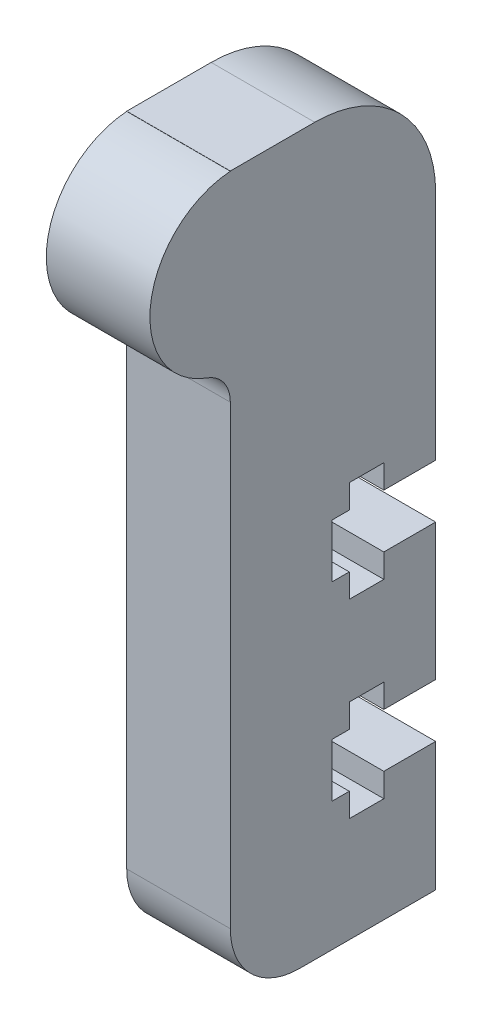
ISO-10303-21;
HEADER;
FILE_DESCRIPTION(('STEP AP214'),'2;1');
FILE_NAME('part.step','',(''),(''),'','','');
FILE_SCHEMA(('AUTOMOTIVE_DESIGN { 1 0 10303 214 1 1 1 1 }'));
ENDSEC;
DATA;
#1=APPLICATION_CONTEXT('core data for automotive mechanical design processes');
#2=APPLICATION_PROTOCOL_DEFINITION('international standard','automotive_design',2000,#1);
#3=PRODUCT_CONTEXT('',#1,'mechanical');
#4=PRODUCT('Part','Part','',(#3));
#5=PRODUCT_RELATED_PRODUCT_CATEGORY('part','',(#4));
#6=PRODUCT_DEFINITION_FORMATION('','',#4);
#7=PRODUCT_DEFINITION_CONTEXT('part definition',#1,'design');
#8=PRODUCT_DEFINITION('design','',#6,#7);
#9=PRODUCT_DEFINITION_SHAPE('','',#8);
#10=(LENGTH_UNIT() NAMED_UNIT(*) SI_UNIT(.MILLI.,.METRE.));
#11=(NAMED_UNIT(*) PLANE_ANGLE_UNIT() SI_UNIT($,.RADIAN.));
#12=(NAMED_UNIT(*) SI_UNIT($,.STERADIAN.) SOLID_ANGLE_UNIT());
#13=UNCERTAINTY_MEASURE_WITH_UNIT(LENGTH_MEASURE(1.E-05),#10,'distance_accuracy_value','');
#14=(GEOMETRIC_REPRESENTATION_CONTEXT(3) GLOBAL_UNCERTAINTY_ASSIGNED_CONTEXT((#13)) GLOBAL_UNIT_ASSIGNED_CONTEXT((#10,
#11,#12)) REPRESENTATION_CONTEXT('',''));
#15=CARTESIAN_POINT('',(0.,0.,0.));
#16=DIRECTION('',(0.,0.,1.));
#17=DIRECTION('',(1.,0.,0.));
#18=AXIS2_PLACEMENT_3D('',#15,#16,#17);
#19=CARTESIAN_POINT('',(-145.250000000058,55.695492388253,2.59251729978901E-13));
#20=DIRECTION('',(0.,0.,1.));
#21=DIRECTION('',(1.,0.,0.));
#22=AXIS2_PLACEMENT_3D('',#19,#20,#21);
#23=PLANE('',#22);
#24=DIRECTION('',(0.,1.,0.));
#25=VECTOR('',#24,1.);
#26=CARTESIAN_POINT('',(-151.250000000058,55.6954923882527,2.62473765699227E-13));
#27=LINE('',#26,#25);
#28=CARTESIAN_POINT('',(-151.250000000058,55.6954923882527,2.62473765699227E-13));
#29=VERTEX_POINT('',#28);
#30=CARTESIAN_POINT('',(-151.250000000059,63.1454923882525,1.72303843189274E-13));
#31=VERTEX_POINT('',#30);
#32=EDGE_CURVE('E425',#29,#31,#27,.T.);
#33=ORIENTED_EDGE('',*,*,#32,.T.);
#34=DIRECTION('',(-1.,0.,0.));
#35=VECTOR('',#34,1.);
#36=CARTESIAN_POINT('',(-131.250000000059,63.1454923882538,1.61563724121521E-13));
#37=LINE('',#36,#35);
#38=CARTESIAN_POINT('',(-145.250000000059,63.1454923882529,1.69081807468948E-13));
#39=VERTEX_POINT('',#38);
#40=EDGE_CURVE('E308',#39,#31,#37,.T.);
#41=ORIENTED_EDGE('',*,*,#40,.F.);
#42=DIRECTION('',(0.,1.,0.));
#43=VECTOR('',#42,1.);
#44=CARTESIAN_POINT('',(-145.250000000058,55.695492388253,2.59251729978901E-13));
#45=LINE('',#44,#43);
#46=CARTESIAN_POINT('',(-145.250000000058,55.695492388253,2.59251729978901E-13));
#47=VERTEX_POINT('',#46);
#48=EDGE_CURVE('E440',#47,#39,#45,.T.);
#49=ORIENTED_EDGE('',*,*,#48,.F.);
#50=DIRECTION('',(-1.,0.,0.));
#51=VECTOR('',#50,1.);
#52=CARTESIAN_POINT('',(-145.250000000058,55.695492388253,2.59251729978901E-13));
#53=LINE('',#52,#51);
#54=EDGE_CURVE('E467',#47,#29,#53,.T.);
#55=ORIENTED_EDGE('',*,*,#54,.T.);
#56=EDGE_LOOP('',(#33,#41,#49,#55));
#57=FACE_BOUND('',#56,.T.);
#58=ADVANCED_FACE('F34',(#57),#23,.F.);
#59=CARTESIAN_POINT('',(-145.250000000059,66.2454923882529,1.67347083992971E-13));
#60=VERTEX_POINT('',#59);
#61=CARTESIAN_POINT('',(-145.250000000059,74.1454923882529,0.));
#62=VERTEX_POINT('',#61);
#63=EDGE_CURVE('E444',#60,#62,#45,.T.);
#64=ORIENTED_EDGE('',*,*,#63,.F.);
#65=DIRECTION('',(-1.,0.,0.));
#66=VECTOR('',#65,1.);
#67=CARTESIAN_POINT('',(-131.250000000059,66.2454923882538,1.59829000645544E-13));
#68=LINE('',#67,#66);
#69=CARTESIAN_POINT('',(-151.250000000059,66.2454923882525,1.70569119713297E-13));
#70=VERTEX_POINT('',#69);
#71=EDGE_CURVE('E310',#60,#70,#68,.T.);
#72=ORIENTED_EDGE('',*,*,#71,.T.);
#73=CARTESIAN_POINT('',(-151.25000000006,74.1454923882525,0.));
#74=VERTEX_POINT('',#73);
#75=EDGE_CURVE('E464',#70,#74,#27,.T.);
#76=ORIENTED_EDGE('',*,*,#75,.T.);
#77=DIRECTION('',(-1.,0.,0.));
#78=VECTOR('',#77,1.);
#79=CARTESIAN_POINT('',(-131.25000000006,74.1454923882538,0.));
#80=LINE('',#79,#78);
#81=EDGE_CURVE('E381',#62,#74,#80,.T.);
#82=ORIENTED_EDGE('',*,*,#81,.F.);
#83=EDGE_LOOP('',(#64,#72,#76,#82));
#84=FACE_BOUND('',#83,.T.);
#85=ADVANCED_FACE('F522',(#84),#23,.F.);
#86=CARTESIAN_POINT('',(-145.25000000006,90.695492388253,7.00000000000027));
#87=DIRECTION('',(-1.,0.,0.));
#88=DIRECTION('',(0.,-1.,0.));
#89=AXIS2_PLACEMENT_3D('',#86,#87,#88);
#90=CYLINDRICAL_SURFACE('',#89,7.00000000000001);
#91=CARTESIAN_POINT('',(-151.25000000006,90.6954923882527,7.00000000000027));
#92=DIRECTION('',(1.,0.,0.));
#93=DIRECTION('',(0.,1.,0.));
#94=AXIS2_PLACEMENT_3D('',#91,#92,#93);
#95=CIRCLE('',#94,7.00000000000001);
#96=CARTESIAN_POINT('',(-151.25000000006,90.6954923882526,2.64208489175204E-13));
#97=VERTEX_POINT('',#96);
#98=CARTESIAN_POINT('',(-151.250000000061,97.6954923882527,7.00000000000032));
#99=VERTEX_POINT('',#98);
#100=EDGE_CURVE('E420',#97,#99,#95,.T.);
#101=ORIENTED_EDGE('',*,*,#100,.T.);
#102=DIRECTION('',(-1.,0.,0.));
#103=VECTOR('',#102,1.);
#104=CARTESIAN_POINT('',(-145.250000000061,97.695492388253,7.00000000000032));
#105=LINE('',#104,#103);
#106=CARTESIAN_POINT('',(-145.250000000061,97.695492388253,7.00000000000032));
#107=VERTEX_POINT('',#106);
#108=EDGE_CURVE('E11',#107,#99,#105,.T.);
#109=ORIENTED_EDGE('',*,*,#108,.F.);
#110=CARTESIAN_POINT('',(-145.25000000006,90.695492388253,7.00000000000027));
#111=DIRECTION('',(1.,0.,0.));
#112=DIRECTION('',(0.,1.,0.));
#113=AXIS2_PLACEMENT_3D('',#110,#111,#112);
#114=CIRCLE('',#113,7.00000000000001);
#115=CARTESIAN_POINT('',(-145.25000000006,90.695492388253,2.60986453454878E-13));
#116=VERTEX_POINT('',#115);
#117=EDGE_CURVE('E421',#116,#107,#114,.T.);
#118=ORIENTED_EDGE('',*,*,#117,.F.);
#119=DIRECTION('',(-1.,0.,0.));
#120=VECTOR('',#119,1.);
#121=CARTESIAN_POINT('',(-145.25000000006,90.695492388253,2.60986453454878E-13));
#122=LINE('',#121,#120);
#123=EDGE_CURVE('E443',#116,#97,#122,.T.);
#124=ORIENTED_EDGE('',*,*,#123,.T.);
#125=EDGE_LOOP('',(#101,#109,#118,#124));
#126=FACE_BOUND('',#125,.T.);
#127=ADVANCED_FACE('F36',(#126),#90,.T.);
#128=CARTESIAN_POINT('',(-145.250000000061,97.695492388253,7.00000000000032));
#129=DIRECTION('',(0.,-1.,0.));
#130=DIRECTION('',(1.,0.,0.));
#131=AXIS2_PLACEMENT_3D('',#128,#129,#130);
#132=PLANE('',#131);
#133=DIRECTION('',(0.,0.,1.));
#134=VECTOR('',#133,1.);
#135=CARTESIAN_POINT('',(-151.250000000061,97.6954923882527,7.00000000000032));
#136=LINE('',#135,#134);
#137=CARTESIAN_POINT('',(-151.250000000061,97.6954923882527,11.8901193530446));
#138=VERTEX_POINT('',#137);
#139=EDGE_CURVE('E447',#99,#138,#136,.T.);
#140=ORIENTED_EDGE('',*,*,#139,.T.);
#141=DIRECTION('',(-1.,0.,0.));
#142=VECTOR('',#141,1.);
#143=CARTESIAN_POINT('',(-145.250000000061,97.695492388253,11.8901193530446));
#144=LINE('',#143,#142);
#145=CARTESIAN_POINT('',(-145.250000000061,97.695492388253,11.8901193530446));
#146=VERTEX_POINT('',#145);
#147=EDGE_CURVE('E42',#146,#138,#144,.T.);
#148=ORIENTED_EDGE('',*,*,#147,.F.);
#149=DIRECTION('',(0.,0.,1.));
#150=VECTOR('',#149,1.);
#151=CARTESIAN_POINT('',(-145.250000000061,97.695492388253,7.00000000000032));
#152=LINE('',#151,#150);
#153=EDGE_CURVE('E424',#107,#146,#152,.T.);
#154=ORIENTED_EDGE('',*,*,#153,.F.);
#155=ORIENTED_EDGE('',*,*,#108,.T.);
#156=EDGE_LOOP('',(#140,#148,#154,#155));
#157=FACE_BOUND('',#156,.T.);
#158=ADVANCED_FACE('F511',(#157),#132,.F.);
#159=CARTESIAN_POINT('',(-145.250000000061,97.695492388253,11.8901193530446));
#160=DIRECTION('',(0.,0.0686506090468687,-0.997640763941357));
#161=DIRECTION('',(0.,0.997640763941357,0.0686506090468687));
#162=AXIS2_PLACEMENT_3D('',#159,#160,#161);
#163=PLANE('',#162);
#164=DIRECTION('',(0.,-0.997640763941357,-0.0686506090468687));
#165=VECTOR('',#164,1.);
#166=CARTESIAN_POINT('',(-151.250000000061,97.6954923882527,11.8901193530446));
#167=LINE('',#166,#165);
#168=CARTESIAN_POINT('',(-151.250000000061,97.6836962079594,11.8893076230203));
#169=VERTEX_POINT('',#168);
#170=EDGE_CURVE('E449',#138,#169,#167,.T.);
#171=ORIENTED_EDGE('',*,*,#170,.T.);
#172=DIRECTION('',(-1.,0.,0.));
#173=VECTOR('',#172,1.);
#174=CARTESIAN_POINT('',(-145.250000000061,97.6836962079598,11.8893076230203));
#175=LINE('',#174,#173);
#176=CARTESIAN_POINT('',(-145.250000000061,97.6836962079598,11.8893076230203));
#177=VERTEX_POINT('',#176);
#178=EDGE_CURVE('E482',#177,#169,#175,.T.);
#179=ORIENTED_EDGE('',*,*,#178,.F.);
#180=DIRECTION('',(0.,-0.997640763941357,-0.0686506090468687));
#181=VECTOR('',#180,1.);
#182=CARTESIAN_POINT('',(-145.250000000061,97.695492388253,11.8901193530446));
#183=LINE('',#182,#181);
#184=EDGE_CURVE('E427',#146,#177,#183,.T.);
#185=ORIENTED_EDGE('',*,*,#184,.F.);
#186=ORIENTED_EDGE('',*,*,#147,.T.);
#187=EDGE_LOOP('',(#171,#179,#185,#186));
#188=FACE_BOUND('',#187,.T.);
#189=ADVANCED_FACE('F489',(#188),#163,.F.);
#190=CARTESIAN_POINT('',(-145.25000000006,92.695492388253,11.5460545777855));
#191=DIRECTION('',(-1.,0.,0.));
#192=DIRECTION('',(0.,-1.,0.));
#193=AXIS2_PLACEMENT_3D('',#190,#191,#192);
#194=CYLINDRICAL_SURFACE('',#193,5.);
#195=CARTESIAN_POINT('',(-151.25000000006,92.6954923882527,11.5460545777855));
#196=DIRECTION('',(1.,0.,0.));
#197=DIRECTION('',(0.,1.,0.));
#198=AXIS2_PLACEMENT_3D('',#195,#196,#197);
#199=CIRCLE('',#198,5.);
#200=CARTESIAN_POINT('',(-151.25000000006,87.983958279693,13.2198067529532));
#201=VERTEX_POINT('',#200);
#202=EDGE_CURVE('E451',#169,#201,#199,.T.);
#203=ORIENTED_EDGE('',*,*,#202,.T.);
#204=DIRECTION('',(-1.,0.,0.));
#205=VECTOR('',#204,1.);
#206=CARTESIAN_POINT('',(-145.25000000006,87.9839582796933,13.2198067529532));
#207=LINE('',#206,#205);
#208=CARTESIAN_POINT('',(-145.25000000006,87.9839582796933,13.2198067529532));
#209=VERTEX_POINT('',#208);
#210=EDGE_CURVE('E479',#209,#201,#207,.T.);
#211=ORIENTED_EDGE('',*,*,#210,.F.);
#212=CARTESIAN_POINT('',(-145.25000000006,92.695492388253,11.5460545777855));
#213=DIRECTION('',(1.,0.,0.));
#214=DIRECTION('',(0.,1.,0.));
#215=AXIS2_PLACEMENT_3D('',#212,#213,#214);
#216=CIRCLE('',#215,5.);
#217=EDGE_CURVE('E429',#177,#209,#216,.T.);
#218=ORIENTED_EDGE('',*,*,#217,.F.);
#219=ORIENTED_EDGE('',*,*,#178,.T.);
#220=EDGE_LOOP('',(#203,#211,#218,#219));
#221=FACE_BOUND('',#220,.T.);
#222=ADVANCED_FACE('F498',(#221),#194,.T.);
#223=CARTESIAN_POINT('',(-145.25000000006,86.0993446362695,13.8893076230203));
#224=DIRECTION('',(-1.,0.,0.));
#225=DIRECTION('',(0.,-1.,0.));
#226=AXIS2_PLACEMENT_3D('',#223,#224,#225);
#227=CYLINDRICAL_SURFACE('',#226,2.);
#228=CARTESIAN_POINT('',(-151.25000000006,86.0993446362691,13.8893076230203));
#229=DIRECTION('',(-1.,0.,0.));
#230=DIRECTION('',(0.,1.,0.));
#231=AXIS2_PLACEMENT_3D('',#228,#229,#230);
#232=CIRCLE('',#231,2.);
#233=CARTESIAN_POINT('',(-151.25000000006,86.0993446362691,11.8893076230203));
#234=VERTEX_POINT('',#233);
#235=EDGE_CURVE('E453',#201,#234,#232,.T.);
#236=ORIENTED_EDGE('',*,*,#235,.T.);
#237=DIRECTION('',(-1.,0.,0.));
#238=VECTOR('',#237,1.);
#239=CARTESIAN_POINT('',(-145.25000000006,86.0993446362695,11.8893076230203));
#240=LINE('',#239,#238);
#241=CARTESIAN_POINT('',(-145.25000000006,86.0993446362695,11.8893076230203));
#242=VERTEX_POINT('',#241);
#243=EDGE_CURVE('E476',#242,#234,#240,.T.);
#244=ORIENTED_EDGE('',*,*,#243,.F.);
#245=CARTESIAN_POINT('',(-145.25000000006,86.0993446362695,13.8893076230203));
#246=DIRECTION('',(-1.,0.,0.));
#247=DIRECTION('',(0.,1.,0.));
#248=AXIS2_PLACEMENT_3D('',#245,#246,#247);
#249=CIRCLE('',#248,2.);
#250=EDGE_CURVE('E431',#209,#242,#249,.T.);
#251=ORIENTED_EDGE('',*,*,#250,.F.);
#252=ORIENTED_EDGE('',*,*,#210,.T.);
#253=EDGE_LOOP('',(#236,#244,#251,#252));
#254=FACE_BOUND('',#253,.T.);
#255=ADVANCED_FACE('F502',(#254),#227,.F.);
#256=CARTESIAN_POINT('',(-145.250000000058,59.695492388253,11.8893076230203));
#257=DIRECTION('',(0.,0.,-1.));
#258=DIRECTION('',(-1.,0.,0.));
#259=AXIS2_PLACEMENT_3D('',#256,#257,#258);
#260=PLANE('',#259);
#261=DIRECTION('',(0.,-1.,0.));
#262=VECTOR('',#261,1.);
#263=CARTESIAN_POINT('',(-151.250000000058,59.6954923882527,11.8893076230203));
#264=LINE('',#263,#262);
#265=CARTESIAN_POINT('',(-151.250000000058,59.6954923882527,11.8893076230203));
#266=VERTEX_POINT('',#265);
#267=EDGE_CURVE('E455',#234,#266,#264,.T.);
#268=ORIENTED_EDGE('',*,*,#267,.T.);
#269=DIRECTION('',(-1.,0.,0.));
#270=VECTOR('',#269,1.);
#271=CARTESIAN_POINT('',(-145.250000000058,59.695492388253,11.8893076230203));
#272=LINE('',#271,#270);
#273=CARTESIAN_POINT('',(-145.250000000058,59.695492388253,11.8893076230203));
#274=VERTEX_POINT('',#273);
#275=EDGE_CURVE('E473',#274,#266,#272,.T.);
#276=ORIENTED_EDGE('',*,*,#275,.F.);
#277=DIRECTION('',(0.,-1.,0.));
#278=VECTOR('',#277,1.);
#279=CARTESIAN_POINT('',(-145.250000000058,59.695492388253,11.8893076230203));
#280=LINE('',#279,#278);
#281=EDGE_CURVE('E433',#242,#274,#280,.T.);
#282=ORIENTED_EDGE('',*,*,#281,.F.);
#283=ORIENTED_EDGE('',*,*,#243,.T.);
#284=EDGE_LOOP('',(#268,#276,#282,#283));
#285=FACE_BOUND('',#284,.T.);
#286=ADVANCED_FACE('F573',(#285),#260,.F.);
#287=CARTESIAN_POINT('',(-145.250000000058,59.695492388253,7.88930762302026));
#288=DIRECTION('',(-1.,0.,0.));
#289=DIRECTION('',(0.,-1.,0.));
#290=AXIS2_PLACEMENT_3D('',#287,#288,#289);
#291=CYLINDRICAL_SURFACE('',#290,3.99999999999999);
#292=CARTESIAN_POINT('',(-151.250000000058,59.6954923882527,7.88930762302027));
#293=DIRECTION('',(1.,0.,0.));
#294=DIRECTION('',(0.,-1.,0.));
#295=AXIS2_PLACEMENT_3D('',#292,#293,#294);
#296=CIRCLE('',#295,3.99999999999999);
#297=CARTESIAN_POINT('',(-151.250000000058,55.6954923882527,7.88930762302027));
#298=VERTEX_POINT('',#297);
#299=EDGE_CURVE('E457',#266,#298,#296,.T.);
#300=ORIENTED_EDGE('',*,*,#299,.T.);
#301=DIRECTION('',(-1.,0.,0.));
#302=VECTOR('',#301,1.);
#303=CARTESIAN_POINT('',(-145.250000000058,55.695492388253,7.88930762302026));
#304=LINE('',#303,#302);
#305=CARTESIAN_POINT('',(-145.250000000058,55.695492388253,7.88930762302026));
#306=VERTEX_POINT('',#305);
#307=EDGE_CURVE('E470',#306,#298,#304,.T.);
#308=ORIENTED_EDGE('',*,*,#307,.F.);
#309=CARTESIAN_POINT('',(-145.250000000058,59.695492388253,7.88930762302026));
#310=DIRECTION('',(1.,0.,0.));
#311=DIRECTION('',(0.,-1.,0.));
#312=AXIS2_PLACEMENT_3D('',#309,#310,#311);
#313=CIRCLE('',#312,3.99999999999999);
#314=EDGE_CURVE('E435',#274,#306,#313,.T.);
#315=ORIENTED_EDGE('',*,*,#314,.F.);
#316=ORIENTED_EDGE('',*,*,#275,.T.);
#317=EDGE_LOOP('',(#300,#308,#315,#316));
#318=FACE_BOUND('',#317,.T.);
#319=ADVANCED_FACE('F551',(#318),#291,.T.);
#320=CARTESIAN_POINT('',(-145.250000000058,55.695492388253,7.88930762302026));
#321=DIRECTION('',(0.,1.,0.));
#322=DIRECTION('',(-1.,0.,0.));
#323=AXIS2_PLACEMENT_3D('',#320,#321,#322);
#324=PLANE('',#323);
#325=DIRECTION('',(0.,0.,-1.));
#326=VECTOR('',#325,1.);
#327=CARTESIAN_POINT('',(-151.250000000058,55.6954923882527,7.88930762302027));
#328=LINE('',#327,#326);
#329=EDGE_CURVE('E459',#298,#29,#328,.T.);
#330=ORIENTED_EDGE('',*,*,#329,.T.);
#331=ORIENTED_EDGE('',*,*,#54,.F.);
#332=DIRECTION('',(0.,0.,-1.));
#333=VECTOR('',#332,1.);
#334=CARTESIAN_POINT('',(-145.250000000058,55.695492388253,7.88930762302026));
#335=LINE('',#334,#333);
#336=EDGE_CURVE('E437',#306,#47,#335,.T.);
#337=ORIENTED_EDGE('',*,*,#336,.F.);
#338=ORIENTED_EDGE('',*,*,#307,.T.);
#339=EDGE_LOOP('',(#330,#331,#337,#338));
#340=FACE_BOUND('',#339,.T.);
#341=ADVANCED_FACE('F544',(#340),#324,.F.);
#342=CARTESIAN_POINT('',(-145.250000000059,77.2454923882529,0.));
#343=VERTEX_POINT('',#342);
#344=EDGE_CURVE('E439',#343,#116,#45,.T.);
#345=ORIENTED_EDGE('',*,*,#344,.F.);
#346=DIRECTION('',(-1.,0.,0.));
#347=VECTOR('',#346,1.);
#348=CARTESIAN_POINT('',(-131.25000000006,77.2454923882538,0.));
#349=LINE('',#348,#347);
#350=CARTESIAN_POINT('',(-151.25000000006,77.2454923882525,0.));
#351=VERTEX_POINT('',#350);
#352=EDGE_CURVE('E384',#343,#351,#349,.T.);
#353=ORIENTED_EDGE('',*,*,#352,.T.);
#354=EDGE_CURVE('E461',#351,#97,#27,.T.);
#355=ORIENTED_EDGE('',*,*,#354,.T.);
#356=ORIENTED_EDGE('',*,*,#123,.F.);
#357=EDGE_LOOP('',(#345,#353,#355,#356));
#358=FACE_BOUND('',#357,.T.);
#359=ADVANCED_FACE('F542',(#358),#23,.F.);
#360=CARTESIAN_POINT('',(-145.25000000006,90.695492388253,7.00000000000027));
#361=DIRECTION('',(1.,0.,0.));
#362=DIRECTION('',(0.,1.,0.));
#363=AXIS2_PLACEMENT_3D('',#360,#361,#362);
#364=PLANE('',#363);
#365=DIRECTION('',(0.,0.,-1.));
#366=VECTOR('',#365,1.);
#367=CARTESIAN_POINT('',(-145.250000000059,63.1454923882529,7.00000000000027));
#368=LINE('',#367,#366);
#369=CARTESIAN_POINT('',(-145.250000000059,63.1454923882529,3.00000000000017));
#370=VERTEX_POINT('',#369);
#371=EDGE_CURVE('E331',#370,#39,#368,.T.);
#372=ORIENTED_EDGE('',*,*,#371,.F.);
#373=DIRECTION('',(0.,1.,0.));
#374=VECTOR('',#373,1.);
#375=CARTESIAN_POINT('',(-145.25000000006,90.695492388253,3.00000000000017));
#376=LINE('',#375,#374);
#377=CARTESIAN_POINT('',(-145.250000000059,61.7704923882529,3.00000000000017));
#378=VERTEX_POINT('',#377);
#379=EDGE_CURVE('E333',#378,#370,#376,.T.);
#380=ORIENTED_EDGE('',*,*,#379,.F.);
#381=DIRECTION('',(0.,0.,-1.));
#382=VECTOR('',#381,1.);
#383=CARTESIAN_POINT('',(-145.250000000058,61.7704923882529,7.00000000000027));
#384=LINE('',#383,#382);
#385=CARTESIAN_POINT('',(-145.250000000058,61.7704923882529,5.00000000000017));
#386=VERTEX_POINT('',#385);
#387=EDGE_CURVE('E335',#386,#378,#384,.T.);
#388=ORIENTED_EDGE('',*,*,#387,.F.);
#389=DIRECTION('',(0.,-1.,0.));
#390=VECTOR('',#389,1.);
#391=CARTESIAN_POINT('',(-145.25000000006,90.695492388253,5.00000000000019));
#392=LINE('',#391,#390);
#393=CARTESIAN_POINT('',(-145.250000000059,63.1454923882529,5.00000000000017));
#394=VERTEX_POINT('',#393);
#395=EDGE_CURVE('E337',#394,#386,#392,.T.);
#396=ORIENTED_EDGE('',*,*,#395,.F.);
#397=DIRECTION('',(0.,0.,-1.));
#398=VECTOR('',#397,1.);
#399=CARTESIAN_POINT('',(-145.250000000059,63.1454923882529,7.00000000000027));
#400=LINE('',#399,#398);
#401=CARTESIAN_POINT('',(-145.250000000059,63.1454923882529,6.00000000000017));
#402=VERTEX_POINT('',#401);
#403=EDGE_CURVE('E339',#402,#394,#400,.T.);
#404=ORIENTED_EDGE('',*,*,#403,.F.);
#405=DIRECTION('',(0.,-1.,0.));
#406=VECTOR('',#405,1.);
#407=CARTESIAN_POINT('',(-145.25000000006,90.695492388253,6.00000000000015));
#408=LINE('',#407,#406);
#409=CARTESIAN_POINT('',(-145.250000000059,66.2454923882529,6.00000000000017));
#410=VERTEX_POINT('',#409);
#411=EDGE_CURVE('E301',#410,#402,#408,.T.);
#412=ORIENTED_EDGE('',*,*,#411,.F.);
#413=DIRECTION('',(0.,0.,1.));
#414=VECTOR('',#413,1.);
#415=CARTESIAN_POINT('',(-145.250000000059,66.2454923882529,7.00000000000027));
#416=LINE('',#415,#414);
#417=CARTESIAN_POINT('',(-145.250000000059,66.2454923882529,5.00000000000017));
#418=VERTEX_POINT('',#417);
#419=EDGE_CURVE('E259',#418,#410,#416,.T.);
#420=ORIENTED_EDGE('',*,*,#419,.F.);
#421=DIRECTION('',(0.,-1.,0.));
#422=VECTOR('',#421,1.);
#423=CARTESIAN_POINT('',(-145.25000000006,90.695492388253,5.00000000000014));
#424=LINE('',#423,#422);
#425=CARTESIAN_POINT('',(-145.250000000059,67.6204923882529,5.00000000000017));
#426=VERTEX_POINT('',#425);
#427=EDGE_CURVE('E323',#426,#418,#424,.T.);
#428=ORIENTED_EDGE('',*,*,#427,.F.);
#429=DIRECTION('',(0.,0.,1.));
#430=VECTOR('',#429,1.);
#431=CARTESIAN_POINT('',(-145.250000000059,67.6204923882529,7.00000000000027));
#432=LINE('',#431,#430);
#433=CARTESIAN_POINT('',(-145.250000000059,67.6204923882529,3.00000000000017));
#434=VERTEX_POINT('',#433);
#435=EDGE_CURVE('E325',#434,#426,#432,.T.);
#436=ORIENTED_EDGE('',*,*,#435,.F.);
#437=DIRECTION('',(0.,1.,0.));
#438=VECTOR('',#437,1.);
#439=CARTESIAN_POINT('',(-145.25000000006,90.695492388253,3.00000000000016));
#440=LINE('',#439,#438);
#441=CARTESIAN_POINT('',(-145.250000000059,66.2454923882529,3.00000000000017));
#442=VERTEX_POINT('',#441);
#443=EDGE_CURVE('E327',#442,#434,#440,.T.);
#444=ORIENTED_EDGE('',*,*,#443,.F.);
#445=DIRECTION('',(0.,0.,1.));
#446=VECTOR('',#445,1.);
#447=CARTESIAN_POINT('',(-145.250000000059,66.2454923882529,7.00000000000027));
#448=LINE('',#447,#446);
#449=EDGE_CURVE('E329',#60,#442,#448,.T.);
#450=ORIENTED_EDGE('',*,*,#449,.F.);
#451=ORIENTED_EDGE('',*,*,#63,.T.);
#452=DIRECTION('',(0.,0.,-1.));
#453=VECTOR('',#452,1.);
#454=CARTESIAN_POINT('',(-145.250000000059,74.1454923882529,7.00000000000027));
#455=LINE('',#454,#453);
#456=CARTESIAN_POINT('',(-145.250000000059,74.1454923882529,3.00000000000004));
#457=VERTEX_POINT('',#456);
#458=EDGE_CURVE('E409',#457,#62,#455,.T.);
#459=ORIENTED_EDGE('',*,*,#458,.F.);
#460=DIRECTION('',(0.,1.,0.));
#461=VECTOR('',#460,1.);
#462=CARTESIAN_POINT('',(-145.25000000006,90.695492388253,3.00000000000004));
#463=LINE('',#462,#461);
#464=CARTESIAN_POINT('',(-145.250000000059,72.7704923882529,3.00000000000004));
#465=VERTEX_POINT('',#464);
#466=EDGE_CURVE('E412',#465,#457,#463,.T.);
#467=ORIENTED_EDGE('',*,*,#466,.F.);
#468=DIRECTION('',(0.,0.,-1.));
#469=VECTOR('',#468,1.);
#470=CARTESIAN_POINT('',(-145.250000000059,72.7704923882529,7.00000000000027));
#471=LINE('',#470,#469);
#472=CARTESIAN_POINT('',(-145.250000000059,72.7704923882529,5.00000000000004));
#473=VERTEX_POINT('',#472);
#474=EDGE_CURVE('E414',#473,#465,#471,.T.);
#475=ORIENTED_EDGE('',*,*,#474,.F.);
#476=DIRECTION('',(0.,-1.,0.));
#477=VECTOR('',#476,1.);
#478=CARTESIAN_POINT('',(-145.25000000006,90.695492388253,5.00000000000005));
#479=LINE('',#478,#477);
#480=CARTESIAN_POINT('',(-145.250000000059,74.1454923882529,5.00000000000004));
#481=VERTEX_POINT('',#480);
#482=EDGE_CURVE('E416',#481,#473,#479,.T.);
#483=ORIENTED_EDGE('',*,*,#482,.F.);
#484=DIRECTION('',(0.,0.,-1.));
#485=VECTOR('',#484,1.);
#486=CARTESIAN_POINT('',(-145.250000000059,74.1454923882529,7.00000000000027));
#487=LINE('',#486,#485);
#488=CARTESIAN_POINT('',(-145.250000000059,74.1454923882529,6.00000000000004));
#489=VERTEX_POINT('',#488);
#490=EDGE_CURVE('E418',#489,#481,#487,.T.);
#491=ORIENTED_EDGE('',*,*,#490,.F.);
#492=DIRECTION('',(0.,-1.,0.));
#493=VECTOR('',#492,1.);
#494=CARTESIAN_POINT('',(-145.25000000006,90.695492388253,6.00000000000003));
#495=LINE('',#494,#493);
#496=CARTESIAN_POINT('',(-145.250000000059,77.2454923882529,6.00000000000003));
#497=VERTEX_POINT('',#496);
#498=EDGE_CURVE('E374',#497,#489,#495,.T.);
#499=ORIENTED_EDGE('',*,*,#498,.F.);
#500=DIRECTION('',(0.,0.,1.));
#501=VECTOR('',#500,1.);
#502=CARTESIAN_POINT('',(-145.250000000059,77.2454923882529,7.00000000000027));
#503=LINE('',#502,#501);
#504=CARTESIAN_POINT('',(-145.250000000059,77.2454923882529,5.00000000000004));
#505=VERTEX_POINT('',#504);
#506=EDGE_CURVE('E399',#505,#497,#503,.T.);
#507=ORIENTED_EDGE('',*,*,#506,.F.);
#508=DIRECTION('',(0.,-1.,0.));
#509=VECTOR('',#508,1.);
#510=CARTESIAN_POINT('',(-145.25000000006,90.695492388253,5.00000000000002));
#511=LINE('',#510,#509);
#512=CARTESIAN_POINT('',(-145.250000000059,78.6204923882529,5.00000000000003));
#513=VERTEX_POINT('',#512);
#514=EDGE_CURVE('E401',#513,#505,#511,.T.);
#515=ORIENTED_EDGE('',*,*,#514,.F.);
#516=DIRECTION('',(0.,0.,1.));
#517=VECTOR('',#516,1.);
#518=CARTESIAN_POINT('',(-145.25000000006,78.6204923882529,7.00000000000027));
#519=LINE('',#518,#517);
#520=CARTESIAN_POINT('',(-145.25000000006,78.6204923882529,3.00000000000003));
#521=VERTEX_POINT('',#520);
#522=EDGE_CURVE('E403',#521,#513,#519,.T.);
#523=ORIENTED_EDGE('',*,*,#522,.F.);
#524=DIRECTION('',(0.,1.,0.));
#525=VECTOR('',#524,1.);
#526=CARTESIAN_POINT('',(-145.25000000006,90.695492388253,3.00000000000003));
#527=LINE('',#526,#525);
#528=CARTESIAN_POINT('',(-145.250000000059,77.2454923882529,3.00000000000003));
#529=VERTEX_POINT('',#528);
#530=EDGE_CURVE('E405',#529,#521,#527,.T.);
#531=ORIENTED_EDGE('',*,*,#530,.F.);
#532=DIRECTION('',(0.,0.,1.));
#533=VECTOR('',#532,1.);
#534=CARTESIAN_POINT('',(-145.250000000059,77.2454923882529,7.00000000000027));
#535=LINE('',#534,#533);
#536=EDGE_CURVE('E407',#343,#529,#535,.T.);
#537=ORIENTED_EDGE('',*,*,#536,.F.);
#538=ORIENTED_EDGE('',*,*,#344,.T.);
#539=ORIENTED_EDGE('',*,*,#117,.T.);
#540=ORIENTED_EDGE('',*,*,#153,.T.);
#541=ORIENTED_EDGE('',*,*,#184,.T.);
#542=ORIENTED_EDGE('',*,*,#217,.T.);
#543=ORIENTED_EDGE('',*,*,#250,.T.);
#544=ORIENTED_EDGE('',*,*,#281,.T.);
#545=ORIENTED_EDGE('',*,*,#314,.T.);
#546=ORIENTED_EDGE('',*,*,#336,.T.);
#547=ORIENTED_EDGE('',*,*,#48,.T.);
#548=EDGE_LOOP('',(#372,#380,#388,#396,#404,#412,#420,#428,#436,#444,#450,#451,#459,#467,#475,
#483,#491,#499,#507,#515,#523,#531,#537,#538,#539,#540,#541,#542,#543,#544,#545,#546,#547));
#549=FACE_BOUND('',#548,.T.);
#550=ADVANCED_FACE('F507',(#549),#364,.T.);
#551=CARTESIAN_POINT('',(-151.25000000006,90.6954923882527,7.00000000000027));
#552=DIRECTION('',(1.,0.,0.));
#553=DIRECTION('',(0.,1.,0.));
#554=AXIS2_PLACEMENT_3D('',#551,#552,#553);
#555=PLANE('',#554);
#556=DIRECTION('',(0.,-1.,0.));
#557=VECTOR('',#556,1.);
#558=CARTESIAN_POINT('',(-151.250000000059,61.7704923882525,3.00000000000017));
#559=LINE('',#558,#557);
#560=CARTESIAN_POINT('',(-151.250000000059,63.1454923882525,3.00000000000017));
#561=VERTEX_POINT('',#560);
#562=CARTESIAN_POINT('',(-151.250000000059,61.7704923882525,3.00000000000017));
#563=VERTEX_POINT('',#562);
#564=EDGE_CURVE('E290',#561,#563,#559,.T.);
#565=ORIENTED_EDGE('',*,*,#564,.F.);
#566=DIRECTION('',(0.,0.,1.));
#567=VECTOR('',#566,1.);
#568=CARTESIAN_POINT('',(-151.250000000059,63.1454923882525,3.00000000000017));
#569=LINE('',#568,#567);
#570=EDGE_CURVE('E287',#31,#561,#569,.T.);
#571=ORIENTED_EDGE('',*,*,#570,.F.);
#572=ORIENTED_EDGE('',*,*,#32,.F.);
#573=ORIENTED_EDGE('',*,*,#329,.F.);
#574=ORIENTED_EDGE('',*,*,#299,.F.);
#575=ORIENTED_EDGE('',*,*,#267,.F.);
#576=ORIENTED_EDGE('',*,*,#235,.F.);
#577=ORIENTED_EDGE('',*,*,#202,.F.);
#578=ORIENTED_EDGE('',*,*,#170,.F.);
#579=ORIENTED_EDGE('',*,*,#139,.F.);
#580=ORIENTED_EDGE('',*,*,#100,.F.);
#581=ORIENTED_EDGE('',*,*,#354,.F.);
#582=DIRECTION('',(0.,0.,-1.));
#583=VECTOR('',#582,1.);
#584=CARTESIAN_POINT('',(-151.25000000006,77.2454923882525,3.00000000000004));
#585=LINE('',#584,#583);
#586=CARTESIAN_POINT('',(-151.25000000006,77.2454923882525,3.00000000000004));
#587=VERTEX_POINT('',#586);
#588=EDGE_CURVE('E357',#587,#351,#585,.T.);
#589=ORIENTED_EDGE('',*,*,#588,.F.);
#590=DIRECTION('',(0.,-1.,0.));
#591=VECTOR('',#590,1.);
#592=CARTESIAN_POINT('',(-151.25000000006,77.2454923882525,3.00000000000004));
#593=LINE('',#592,#591);
#594=CARTESIAN_POINT('',(-151.25000000006,78.6204923882525,3.00000000000004));
#595=VERTEX_POINT('',#594);
#596=EDGE_CURVE('E354',#595,#587,#593,.T.);
#597=ORIENTED_EDGE('',*,*,#596,.F.);
#598=DIRECTION('',(0.,0.,-1.));
#599=VECTOR('',#598,1.);
#600=CARTESIAN_POINT('',(-151.25000000006,78.6204923882525,3.00000000000004));
#601=LINE('',#600,#599);
#602=CARTESIAN_POINT('',(-151.25000000006,78.6204923882525,5.00000000000004));
#603=VERTEX_POINT('',#602);
#604=EDGE_CURVE('E351',#603,#595,#601,.T.);
#605=ORIENTED_EDGE('',*,*,#604,.F.);
#606=DIRECTION('',(0.,1.,0.));
#607=VECTOR('',#606,1.);
#608=CARTESIAN_POINT('',(-151.25000000006,77.2454923882525,5.00000000000004));
#609=LINE('',#608,#607);
#610=CARTESIAN_POINT('',(-151.25000000006,77.2454923882525,5.00000000000004));
#611=VERTEX_POINT('',#610);
#612=EDGE_CURVE('E348',#611,#603,#609,.T.);
#613=ORIENTED_EDGE('',*,*,#612,.F.);
#614=DIRECTION('',(0.,0.,-1.));
#615=VECTOR('',#614,1.);
#616=CARTESIAN_POINT('',(-151.25000000006,77.2454923882525,6.00000000000004));
#617=LINE('',#616,#615);
#618=CARTESIAN_POINT('',(-151.25000000006,77.2454923882525,6.00000000000004));
#619=VERTEX_POINT('',#618);
#620=EDGE_CURVE('E345',#619,#611,#617,.T.);
#621=ORIENTED_EDGE('',*,*,#620,.F.);
#622=DIRECTION('',(0.,1.,0.));
#623=VECTOR('',#622,1.);
#624=CARTESIAN_POINT('',(-151.25000000006,74.1454923882525,6.00000000000004));
#625=LINE('',#624,#623);
#626=CARTESIAN_POINT('',(-151.250000000059,74.1454923882525,6.00000000000004));
#627=VERTEX_POINT('',#626);
#628=EDGE_CURVE('E342',#627,#619,#625,.T.);
#629=ORIENTED_EDGE('',*,*,#628,.F.);
#630=DIRECTION('',(0.,0.,1.));
#631=VECTOR('',#630,1.);
#632=CARTESIAN_POINT('',(-151.25000000006,74.1454923882525,6.00000000000004));
#633=LINE('',#632,#631);
#634=CARTESIAN_POINT('',(-151.25000000006,74.1454923882525,5.00000000000004));
#635=VERTEX_POINT('',#634);
#636=EDGE_CURVE('E57',#635,#627,#633,.T.);
#637=ORIENTED_EDGE('',*,*,#636,.F.);
#638=DIRECTION('',(0.,1.,0.));
#639=VECTOR('',#638,1.);
#640=CARTESIAN_POINT('',(-151.250000000059,72.7704923882525,5.00000000000004));
#641=LINE('',#640,#639);
#642=CARTESIAN_POINT('',(-151.250000000059,72.7704923882525,5.00000000000004));
#643=VERTEX_POINT('',#642);
#644=EDGE_CURVE('E368',#643,#635,#641,.T.);
#645=ORIENTED_EDGE('',*,*,#644,.F.);
#646=DIRECTION('',(0.,0.,1.));
#647=VECTOR('',#646,1.);
#648=CARTESIAN_POINT('',(-151.250000000059,72.7704923882525,3.00000000000004));
#649=LINE('',#648,#647);
#650=CARTESIAN_POINT('',(-151.250000000059,72.7704923882525,3.00000000000004));
#651=VERTEX_POINT('',#650);
#652=EDGE_CURVE('E365',#651,#643,#649,.T.);
#653=ORIENTED_EDGE('',*,*,#652,.F.);
#654=DIRECTION('',(0.,-1.,0.));
#655=VECTOR('',#654,1.);
#656=CARTESIAN_POINT('',(-151.250000000059,72.7704923882525,3.00000000000004));
#657=LINE('',#656,#655);
#658=CARTESIAN_POINT('',(-151.25000000006,74.1454923882525,3.00000000000004));
#659=VERTEX_POINT('',#658);
#660=EDGE_CURVE('E362',#659,#651,#657,.T.);
#661=ORIENTED_EDGE('',*,*,#660,.F.);
#662=DIRECTION('',(0.,0.,1.));
#663=VECTOR('',#662,1.);
#664=CARTESIAN_POINT('',(-151.25000000006,74.1454923882525,3.00000000000004));
#665=LINE('',#664,#663);
#666=EDGE_CURVE('E359',#74,#659,#665,.T.);
#667=ORIENTED_EDGE('',*,*,#666,.F.);
#668=ORIENTED_EDGE('',*,*,#75,.F.);
#669=DIRECTION('',(0.,0.,-1.));
#670=VECTOR('',#669,1.);
#671=CARTESIAN_POINT('',(-151.250000000059,66.2454923882525,3.00000000000017));
#672=LINE('',#671,#670);
#673=CARTESIAN_POINT('',(-151.250000000059,66.2454923882525,3.00000000000017));
#674=VERTEX_POINT('',#673);
#675=EDGE_CURVE('E285',#674,#70,#672,.T.);
#676=ORIENTED_EDGE('',*,*,#675,.F.);
#677=DIRECTION('',(0.,-1.,0.));
#678=VECTOR('',#677,1.);
#679=CARTESIAN_POINT('',(-151.250000000059,66.2454923882525,3.00000000000017));
#680=LINE('',#679,#678);
#681=CARTESIAN_POINT('',(-151.250000000059,67.6204923882525,3.00000000000017));
#682=VERTEX_POINT('',#681);
#683=EDGE_CURVE('E282',#682,#674,#680,.T.);
#684=ORIENTED_EDGE('',*,*,#683,.F.);
#685=DIRECTION('',(0.,0.,-1.));
#686=VECTOR('',#685,1.);
#687=CARTESIAN_POINT('',(-151.250000000059,67.6204923882525,3.00000000000017));
#688=LINE('',#687,#686);
#689=CARTESIAN_POINT('',(-151.250000000059,67.6204923882525,5.00000000000017));
#690=VERTEX_POINT('',#689);
#691=EDGE_CURVE('E276',#690,#682,#688,.T.);
#692=ORIENTED_EDGE('',*,*,#691,.F.);
#693=DIRECTION('',(0.,1.,0.));
#694=VECTOR('',#693,1.);
#695=CARTESIAN_POINT('',(-151.250000000059,66.2454923882525,5.00000000000017));
#696=LINE('',#695,#694);
#697=CARTESIAN_POINT('',(-151.250000000059,66.2454923882525,5.00000000000017));
#698=VERTEX_POINT('',#697);
#699=EDGE_CURVE('E274',#698,#690,#696,.T.);
#700=ORIENTED_EDGE('',*,*,#699,.F.);
#701=DIRECTION('',(0.,0.,-1.));
#702=VECTOR('',#701,1.);
#703=CARTESIAN_POINT('',(-151.250000000059,66.2454923882525,6.00000000000017));
#704=LINE('',#703,#702);
#705=CARTESIAN_POINT('',(-151.250000000059,66.2454923882525,6.00000000000017));
#706=VERTEX_POINT('',#705);
#707=EDGE_CURVE('E256',#706,#698,#704,.T.);
#708=ORIENTED_EDGE('',*,*,#707,.F.);
#709=DIRECTION('',(0.,1.,0.));
#710=VECTOR('',#709,1.);
#711=CARTESIAN_POINT('',(-151.250000000059,63.1454923882525,6.00000000000017));
#712=LINE('',#711,#710);
#713=CARTESIAN_POINT('',(-151.250000000059,63.1454923882525,6.00000000000017));
#714=VERTEX_POINT('',#713);
#715=EDGE_CURVE('E266',#714,#706,#712,.T.);
#716=ORIENTED_EDGE('',*,*,#715,.F.);
#717=DIRECTION('',(0.,0.,1.));
#718=VECTOR('',#717,1.);
#719=CARTESIAN_POINT('',(-151.250000000059,63.1454923882525,6.00000000000017));
#720=LINE('',#719,#718);
#721=CARTESIAN_POINT('',(-151.250000000059,63.1454923882525,5.00000000000017));
#722=VERTEX_POINT('',#721);
#723=EDGE_CURVE('E49',#722,#714,#720,.T.);
#724=ORIENTED_EDGE('',*,*,#723,.F.);
#725=DIRECTION('',(0.,1.,0.));
#726=VECTOR('',#725,1.);
#727=CARTESIAN_POINT('',(-151.250000000059,61.7704923882525,5.00000000000017));
#728=LINE('',#727,#726);
#729=CARTESIAN_POINT('',(-151.250000000059,61.7704923882525,5.00000000000017));
#730=VERTEX_POINT('',#729);
#731=EDGE_CURVE('E296',#730,#722,#728,.T.);
#732=ORIENTED_EDGE('',*,*,#731,.F.);
#733=DIRECTION('',(0.,0.,1.));
#734=VECTOR('',#733,1.);
#735=CARTESIAN_POINT('',(-151.250000000059,61.7704923882525,3.00000000000017));
#736=LINE('',#735,#734);
#737=EDGE_CURVE('E293',#563,#730,#736,.T.);
#738=ORIENTED_EDGE('',*,*,#737,.F.);
#739=EDGE_LOOP('',(#565,#571,#572,#573,#574,#575,#576,#577,#578,#579,#580,#581,#589,#597,#605,
#613,#621,#629,#637,#645,#653,#661,#667,#668,#676,#684,#692,#700,#708,#716,#724,#732,#738));
#740=FACE_BOUND('',#739,.T.);
#741=ADVANCED_FACE('F271',(#740),#555,.F.);
#742=CARTESIAN_POINT('',(-131.25000000006,74.1454923882538,6.00000000000003));
#743=DIRECTION('',(0.,-1.,0.));
#744=DIRECTION('',(1.,0.,0.));
#745=AXIS2_PLACEMENT_3D('',#742,#743,#744);
#746=PLANE('',#745);
#747=ORIENTED_EDGE('',*,*,#490,.T.);
#748=DIRECTION('',(-1.,0.,0.));
#749=VECTOR('',#748,1.);
#750=CARTESIAN_POINT('',(-131.25000000006,74.1454923882538,5.00000000000003));
#751=LINE('',#750,#749);
#752=EDGE_CURVE('E372',#481,#635,#751,.T.);
#753=ORIENTED_EDGE('',*,*,#752,.T.);
#754=ORIENTED_EDGE('',*,*,#636,.T.);
#755=DIRECTION('',(-1.,0.,0.));
#756=VECTOR('',#755,1.);
#757=CARTESIAN_POINT('',(-131.25000000006,74.1454923882538,6.00000000000003));
#758=LINE('',#757,#756);
#759=EDGE_CURVE('E371',#489,#627,#758,.T.);
#760=ORIENTED_EDGE('',*,*,#759,.F.);
#761=EDGE_LOOP('',(#747,#753,#754,#760));
#762=FACE_BOUND('',#761,.T.);
#763=ADVANCED_FACE('F628',(#762),#746,.F.);
#764=CARTESIAN_POINT('',(-131.250000000059,72.7704923882538,5.00000000000003));
#765=DIRECTION('',(0.,0.,1.));
#766=DIRECTION('',(0.,-1.,0.));
#767=AXIS2_PLACEMENT_3D('',#764,#765,#766);
#768=PLANE('',#767);
#769=ORIENTED_EDGE('',*,*,#482,.T.);
#770=DIRECTION('',(-1.,0.,0.));
#771=VECTOR('',#770,1.);
#772=CARTESIAN_POINT('',(-131.250000000059,72.7704923882538,5.00000000000003));
#773=LINE('',#772,#771);
#774=EDGE_CURVE('E375',#473,#643,#773,.T.);
#775=ORIENTED_EDGE('',*,*,#774,.T.);
#776=ORIENTED_EDGE('',*,*,#644,.T.);
#777=ORIENTED_EDGE('',*,*,#752,.F.);
#778=EDGE_LOOP('',(#769,#775,#776,#777));
#779=FACE_BOUND('',#778,.T.);
#780=ADVANCED_FACE('F624',(#779),#768,.F.);
#781=CARTESIAN_POINT('',(-131.250000000059,72.7704923882538,3.00000000000003));
#782=DIRECTION('',(0.,-1.,0.));
#783=DIRECTION('',(1.,0.,0.));
#784=AXIS2_PLACEMENT_3D('',#781,#782,#783);
#785=PLANE('',#784);
#786=ORIENTED_EDGE('',*,*,#474,.T.);
#787=DIRECTION('',(-1.,0.,0.));
#788=VECTOR('',#787,1.);
#789=CARTESIAN_POINT('',(-131.250000000059,72.7704923882538,3.00000000000003));
#790=LINE('',#789,#788);
#791=EDGE_CURVE('E377',#465,#651,#790,.T.);
#792=ORIENTED_EDGE('',*,*,#791,.T.);
#793=ORIENTED_EDGE('',*,*,#652,.T.);
#794=ORIENTED_EDGE('',*,*,#774,.F.);
#795=EDGE_LOOP('',(#786,#792,#793,#794));
#796=FACE_BOUND('',#795,.T.);
#797=ADVANCED_FACE('F627',(#796),#785,.F.);
#798=CARTESIAN_POINT('',(-131.250000000059,72.7704923882538,3.00000000000003));
#799=DIRECTION('',(0.,0.,-1.));
#800=DIRECTION('',(-1.,0.,0.));
#801=AXIS2_PLACEMENT_3D('',#798,#799,#800);
#802=PLANE('',#801);
#803=ORIENTED_EDGE('',*,*,#466,.T.);
#804=DIRECTION('',(-1.,0.,0.));
#805=VECTOR('',#804,1.);
#806=CARTESIAN_POINT('',(-131.25000000006,74.1454923882538,3.00000000000003));
#807=LINE('',#806,#805);
#808=EDGE_CURVE('E379',#457,#659,#807,.T.);
#809=ORIENTED_EDGE('',*,*,#808,.T.);
#810=ORIENTED_EDGE('',*,*,#660,.T.);
#811=ORIENTED_EDGE('',*,*,#791,.F.);
#812=EDGE_LOOP('',(#803,#809,#810,#811));
#813=FACE_BOUND('',#812,.T.);
#814=ADVANCED_FACE('F534',(#813),#802,.F.);
#815=CARTESIAN_POINT('',(-131.25000000006,74.1454923882538,3.00000000000003));
#816=DIRECTION('',(0.,-1.,0.));
#817=DIRECTION('',(1.,0.,0.));
#818=AXIS2_PLACEMENT_3D('',#815,#816,#817);
#819=PLANE('',#818);
#820=ORIENTED_EDGE('',*,*,#458,.T.);
#821=ORIENTED_EDGE('',*,*,#81,.T.);
#822=ORIENTED_EDGE('',*,*,#666,.T.);
#823=ORIENTED_EDGE('',*,*,#808,.F.);
#824=EDGE_LOOP('',(#820,#821,#822,#823));
#825=FACE_BOUND('',#824,.T.);
#826=ADVANCED_FACE('F526',(#825),#819,.F.);
#827=CARTESIAN_POINT('',(-131.25000000006,77.2454923882538,3.00000000000003));
#828=DIRECTION('',(0.,1.,0.));
#829=DIRECTION('',(-1.,0.,0.));
#830=AXIS2_PLACEMENT_3D('',#827,#828,#829);
#831=PLANE('',#830);
#832=ORIENTED_EDGE('',*,*,#536,.T.);
#833=DIRECTION('',(-1.,0.,0.));
#834=VECTOR('',#833,1.);
#835=CARTESIAN_POINT('',(-131.25000000006,77.2454923882538,3.00000000000003));
#836=LINE('',#835,#834);
#837=EDGE_CURVE('E387',#529,#587,#836,.T.);
#838=ORIENTED_EDGE('',*,*,#837,.T.);
#839=ORIENTED_EDGE('',*,*,#588,.T.);
#840=ORIENTED_EDGE('',*,*,#352,.F.);
#841=EDGE_LOOP('',(#832,#838,#839,#840));
#842=FACE_BOUND('',#841,.T.);
#843=ADVANCED_FACE('F637',(#842),#831,.F.);
#844=CARTESIAN_POINT('',(-131.25000000006,77.2454923882538,3.00000000000003));
#845=DIRECTION('',(0.,0.,-1.));
#846=DIRECTION('',(-1.,0.,0.));
#847=AXIS2_PLACEMENT_3D('',#844,#845,#846);
#848=PLANE('',#847);
#849=ORIENTED_EDGE('',*,*,#530,.T.);
#850=DIRECTION('',(-1.,0.,0.));
#851=VECTOR('',#850,1.);
#852=CARTESIAN_POINT('',(-131.25000000006,78.6204923882538,3.00000000000003));
#853=LINE('',#852,#851);
#854=EDGE_CURVE('E389',#521,#595,#853,.T.);
#855=ORIENTED_EDGE('',*,*,#854,.T.);
#856=ORIENTED_EDGE('',*,*,#596,.T.);
#857=ORIENTED_EDGE('',*,*,#837,.F.);
#858=EDGE_LOOP('',(#849,#855,#856,#857));
#859=FACE_BOUND('',#858,.T.);
#860=ADVANCED_FACE('F640',(#859),#848,.F.);
#861=CARTESIAN_POINT('',(-131.25000000006,78.6204923882538,3.00000000000003));
#862=DIRECTION('',(0.,1.,0.));
#863=DIRECTION('',(-1.,0.,0.));
#864=AXIS2_PLACEMENT_3D('',#861,#862,#863);
#865=PLANE('',#864);
#866=ORIENTED_EDGE('',*,*,#522,.T.);
#867=DIRECTION('',(-1.,0.,0.));
#868=VECTOR('',#867,1.);
#869=CARTESIAN_POINT('',(-131.25000000006,78.6204923882538,5.00000000000003));
#870=LINE('',#869,#868);
#871=EDGE_CURVE('E391',#513,#603,#870,.T.);
#872=ORIENTED_EDGE('',*,*,#871,.T.);
#873=ORIENTED_EDGE('',*,*,#604,.T.);
#874=ORIENTED_EDGE('',*,*,#854,.F.);
#875=EDGE_LOOP('',(#866,#872,#873,#874));
#876=FACE_BOUND('',#875,.T.);
#877=ADVANCED_FACE('F644',(#876),#865,.F.);
#878=CARTESIAN_POINT('',(-131.25000000006,77.2454923882538,5.00000000000003));
#879=DIRECTION('',(0.,0.,1.));
#880=DIRECTION('',(0.,-1.,0.));
#881=AXIS2_PLACEMENT_3D('',#878,#879,#880);
#882=PLANE('',#881);
#883=ORIENTED_EDGE('',*,*,#514,.T.);
#884=DIRECTION('',(-1.,0.,0.));
#885=VECTOR('',#884,1.);
#886=CARTESIAN_POINT('',(-131.25000000006,77.2454923882538,5.00000000000003));
#887=LINE('',#886,#885);
#888=EDGE_CURVE('E393',#505,#611,#887,.T.);
#889=ORIENTED_EDGE('',*,*,#888,.T.);
#890=ORIENTED_EDGE('',*,*,#612,.T.);
#891=ORIENTED_EDGE('',*,*,#871,.F.);
#892=EDGE_LOOP('',(#883,#889,#890,#891));
#893=FACE_BOUND('',#892,.T.);
#894=ADVANCED_FACE('F648',(#893),#882,.F.);
#895=CARTESIAN_POINT('',(-131.25000000006,77.2454923882538,6.00000000000003));
#896=DIRECTION('',(0.,1.,0.));
#897=DIRECTION('',(-1.,0.,0.));
#898=AXIS2_PLACEMENT_3D('',#895,#896,#897);
#899=PLANE('',#898);
#900=ORIENTED_EDGE('',*,*,#506,.T.);
#901=DIRECTION('',(-1.,0.,0.));
#902=VECTOR('',#901,1.);
#903=CARTESIAN_POINT('',(-131.25000000006,77.2454923882538,6.00000000000003));
#904=LINE('',#903,#902);
#905=EDGE_CURVE('E395',#497,#619,#904,.T.);
#906=ORIENTED_EDGE('',*,*,#905,.T.);
#907=ORIENTED_EDGE('',*,*,#620,.T.);
#908=ORIENTED_EDGE('',*,*,#888,.F.);
#909=EDGE_LOOP('',(#900,#906,#907,#908));
#910=FACE_BOUND('',#909,.T.);
#911=ADVANCED_FACE('F618',(#910),#899,.F.);
#912=CARTESIAN_POINT('',(-131.25000000006,74.1454923882538,6.00000000000003));
#913=DIRECTION('',(0.,0.,1.));
#914=DIRECTION('',(0.,-1.,0.));
#915=AXIS2_PLACEMENT_3D('',#912,#913,#914);
#916=PLANE('',#915);
#917=ORIENTED_EDGE('',*,*,#498,.T.);
#918=ORIENTED_EDGE('',*,*,#759,.T.);
#919=ORIENTED_EDGE('',*,*,#628,.T.);
#920=ORIENTED_EDGE('',*,*,#905,.F.);
#921=EDGE_LOOP('',(#917,#918,#919,#920));
#922=FACE_BOUND('',#921,.T.);
#923=ADVANCED_FACE('F611',(#922),#916,.F.);
#924=CARTESIAN_POINT('',(-131.250000000059,63.1454923882538,6.00000000000016));
#925=DIRECTION('',(0.,-1.,0.));
#926=DIRECTION('',(1.,0.,0.));
#927=AXIS2_PLACEMENT_3D('',#924,#925,#926);
#928=PLANE('',#927);
#929=ORIENTED_EDGE('',*,*,#403,.T.);
#930=DIRECTION('',(-1.,0.,0.));
#931=VECTOR('',#930,1.);
#932=CARTESIAN_POINT('',(-131.250000000059,63.1454923882538,5.00000000000016));
#933=LINE('',#932,#931);
#934=EDGE_CURVE('E299',#394,#722,#933,.T.);
#935=ORIENTED_EDGE('',*,*,#934,.T.);
#936=ORIENTED_EDGE('',*,*,#723,.T.);
#937=DIRECTION('',(-1.,0.,0.));
#938=VECTOR('',#937,1.);
#939=CARTESIAN_POINT('',(-131.250000000059,63.1454923882538,6.00000000000016));
#940=LINE('',#939,#938);
#941=EDGE_CURVE('E263',#402,#714,#940,.T.);
#942=ORIENTED_EDGE('',*,*,#941,.F.);
#943=EDGE_LOOP('',(#929,#935,#936,#942));
#944=FACE_BOUND('',#943,.T.);
#945=ADVANCED_FACE('F609',(#944),#928,.F.);
#946=CARTESIAN_POINT('',(-131.250000000059,61.7704923882538,5.00000000000016));
#947=DIRECTION('',(0.,0.,1.));
#948=DIRECTION('',(0.,-1.,0.));
#949=AXIS2_PLACEMENT_3D('',#946,#947,#948);
#950=PLANE('',#949);
#951=ORIENTED_EDGE('',*,*,#395,.T.);
#952=DIRECTION('',(-1.,0.,0.));
#953=VECTOR('',#952,1.);
#954=CARTESIAN_POINT('',(-131.250000000059,61.7704923882538,5.00000000000016));
#955=LINE('',#954,#953);
#956=EDGE_CURVE('E302',#386,#730,#955,.T.);
#957=ORIENTED_EDGE('',*,*,#956,.T.);
#958=ORIENTED_EDGE('',*,*,#731,.T.);
#959=ORIENTED_EDGE('',*,*,#934,.F.);
#960=EDGE_LOOP('',(#951,#957,#958,#959));
#961=FACE_BOUND('',#960,.T.);
#962=ADVANCED_FACE('F608',(#961),#950,.F.);
#963=CARTESIAN_POINT('',(-131.250000000059,61.7704923882538,3.00000000000016));
#964=DIRECTION('',(0.,-1.,0.));
#965=DIRECTION('',(1.,0.,0.));
#966=AXIS2_PLACEMENT_3D('',#963,#964,#965);
#967=PLANE('',#966);
#968=ORIENTED_EDGE('',*,*,#387,.T.);
#969=DIRECTION('',(-1.,0.,0.));
#970=VECTOR('',#969,1.);
#971=CARTESIAN_POINT('',(-131.250000000059,61.7704923882538,3.00000000000016));
#972=LINE('',#971,#970);
#973=EDGE_CURVE('E304',#378,#563,#972,.T.);
#974=ORIENTED_EDGE('',*,*,#973,.T.);
#975=ORIENTED_EDGE('',*,*,#737,.T.);
#976=ORIENTED_EDGE('',*,*,#956,.F.);
#977=EDGE_LOOP('',(#968,#974,#975,#976));
#978=FACE_BOUND('',#977,.T.);
#979=ADVANCED_FACE('F601',(#978),#967,.F.);
#980=CARTESIAN_POINT('',(-131.250000000059,61.7704923882538,3.00000000000016));
#981=DIRECTION('',(0.,0.,-1.));
#982=DIRECTION('',(-1.,0.,0.));
#983=AXIS2_PLACEMENT_3D('',#980,#981,#982);
#984=PLANE('',#983);
#985=ORIENTED_EDGE('',*,*,#379,.T.);
#986=DIRECTION('',(-1.,0.,0.));
#987=VECTOR('',#986,1.);
#988=CARTESIAN_POINT('',(-131.250000000059,63.1454923882538,3.00000000000016));
#989=LINE('',#988,#987);
#990=EDGE_CURVE('E306',#370,#561,#989,.T.);
#991=ORIENTED_EDGE('',*,*,#990,.T.);
#992=ORIENTED_EDGE('',*,*,#564,.T.);
#993=ORIENTED_EDGE('',*,*,#973,.F.);
#994=EDGE_LOOP('',(#985,#991,#992,#993));
#995=FACE_BOUND('',#994,.T.);
#996=ADVANCED_FACE('F597',(#995),#984,.F.);
#997=CARTESIAN_POINT('',(-131.250000000059,63.1454923882538,3.00000000000016));
#998=DIRECTION('',(0.,-1.,0.));
#999=DIRECTION('',(1.,0.,0.));
#1000=AXIS2_PLACEMENT_3D('',#997,#998,#999);
#1001=PLANE('',#1000);
#1002=ORIENTED_EDGE('',*,*,#371,.T.);
#1003=ORIENTED_EDGE('',*,*,#40,.T.);
#1004=ORIENTED_EDGE('',*,*,#570,.T.);
#1005=ORIENTED_EDGE('',*,*,#990,.F.);
#1006=EDGE_LOOP('',(#1002,#1003,#1004,#1005));
#1007=FACE_BOUND('',#1006,.T.);
#1008=ADVANCED_FACE('F595',(#1007),#1001,.F.);
#1009=CARTESIAN_POINT('',(-131.250000000059,66.2454923882538,3.00000000000016));
#1010=DIRECTION('',(0.,1.,0.));
#1011=DIRECTION('',(-1.,0.,0.));
#1012=AXIS2_PLACEMENT_3D('',#1009,#1010,#1011);
#1013=PLANE('',#1012);
#1014=ORIENTED_EDGE('',*,*,#449,.T.);
#1015=DIRECTION('',(-1.,0.,0.));
#1016=VECTOR('',#1015,1.);
#1017=CARTESIAN_POINT('',(-131.250000000059,66.2454923882538,3.00000000000016));
#1018=LINE('',#1017,#1016);
#1019=EDGE_CURVE('E313',#442,#674,#1018,.T.);
#1020=ORIENTED_EDGE('',*,*,#1019,.T.);
#1021=ORIENTED_EDGE('',*,*,#675,.T.);
#1022=ORIENTED_EDGE('',*,*,#71,.F.);
#1023=EDGE_LOOP('',(#1014,#1020,#1021,#1022));
#1024=FACE_BOUND('',#1023,.T.);
#1025=ADVANCED_FACE('F821',(#1024),#1013,.F.);
#1026=CARTESIAN_POINT('',(-131.250000000059,66.2454923882538,3.00000000000016));
#1027=DIRECTION('',(0.,0.,-1.));
#1028=DIRECTION('',(-1.,0.,0.));
#1029=AXIS2_PLACEMENT_3D('',#1026,#1027,#1028);
#1030=PLANE('',#1029);
#1031=ORIENTED_EDGE('',*,*,#443,.T.);
#1032=DIRECTION('',(-1.,0.,0.));
#1033=VECTOR('',#1032,1.);
#1034=CARTESIAN_POINT('',(-131.250000000059,67.6204923882538,3.00000000000016));
#1035=LINE('',#1034,#1033);
#1036=EDGE_CURVE('E315',#434,#682,#1035,.T.);
#1037=ORIENTED_EDGE('',*,*,#1036,.T.);
#1038=ORIENTED_EDGE('',*,*,#683,.T.);
#1039=ORIENTED_EDGE('',*,*,#1019,.F.);
#1040=EDGE_LOOP('',(#1031,#1037,#1038,#1039));
#1041=FACE_BOUND('',#1040,.T.);
#1042=ADVANCED_FACE('F829',(#1041),#1030,.F.);
#1043=CARTESIAN_POINT('',(-131.250000000059,67.6204923882538,3.00000000000016));
#1044=DIRECTION('',(0.,1.,0.));
#1045=DIRECTION('',(-1.,0.,0.));
#1046=AXIS2_PLACEMENT_3D('',#1043,#1044,#1045);
#1047=PLANE('',#1046);
#1048=ORIENTED_EDGE('',*,*,#435,.T.);
#1049=DIRECTION('',(-1.,0.,0.));
#1050=VECTOR('',#1049,1.);
#1051=CARTESIAN_POINT('',(-131.250000000059,67.6204923882538,5.00000000000016));
#1052=LINE('',#1051,#1050);
#1053=EDGE_CURVE('E317',#426,#690,#1052,.T.);
#1054=ORIENTED_EDGE('',*,*,#1053,.T.);
#1055=ORIENTED_EDGE('',*,*,#691,.T.);
#1056=ORIENTED_EDGE('',*,*,#1036,.F.);
#1057=EDGE_LOOP('',(#1048,#1054,#1055,#1056));
#1058=FACE_BOUND('',#1057,.T.);
#1059=ADVANCED_FACE('F838',(#1058),#1047,.F.);
#1060=CARTESIAN_POINT('',(-131.250000000059,66.2454923882538,5.00000000000016));
#1061=DIRECTION('',(0.,0.,1.));
#1062=DIRECTION('',(0.,-1.,0.));
#1063=AXIS2_PLACEMENT_3D('',#1060,#1061,#1062);
#1064=PLANE('',#1063);
#1065=ORIENTED_EDGE('',*,*,#427,.T.);
#1066=DIRECTION('',(-1.,0.,0.));
#1067=VECTOR('',#1066,1.);
#1068=CARTESIAN_POINT('',(-131.250000000059,66.2454923882538,5.00000000000016));
#1069=LINE('',#1068,#1067);
#1070=EDGE_CURVE('E262',#418,#698,#1069,.T.);
#1071=ORIENTED_EDGE('',*,*,#1070,.T.);
#1072=ORIENTED_EDGE('',*,*,#699,.T.);
#1073=ORIENTED_EDGE('',*,*,#1053,.F.);
#1074=EDGE_LOOP('',(#1065,#1071,#1072,#1073));
#1075=FACE_BOUND('',#1074,.T.);
#1076=ADVANCED_FACE('F847',(#1075),#1064,.F.);
#1077=CARTESIAN_POINT('',(-131.250000000059,66.2454923882538,6.00000000000016));
#1078=DIRECTION('',(0.,1.,0.));
#1079=DIRECTION('',(-1.,0.,0.));
#1080=AXIS2_PLACEMENT_3D('',#1077,#1078,#1079);
#1081=PLANE('',#1080);
#1082=ORIENTED_EDGE('',*,*,#419,.T.);
#1083=DIRECTION('',(-1.,0.,0.));
#1084=VECTOR('',#1083,1.);
#1085=CARTESIAN_POINT('',(-131.250000000059,66.2454923882538,6.00000000000016));
#1086=LINE('',#1085,#1084);
#1087=EDGE_CURVE('E251',#410,#706,#1086,.T.);
#1088=ORIENTED_EDGE('',*,*,#1087,.T.);
#1089=ORIENTED_EDGE('',*,*,#707,.T.);
#1090=ORIENTED_EDGE('',*,*,#1070,.F.);
#1091=EDGE_LOOP('',(#1082,#1088,#1089,#1090));
#1092=FACE_BOUND('',#1091,.T.);
#1093=ADVANCED_FACE('F253',(#1092),#1081,.F.);
#1094=CARTESIAN_POINT('',(-131.250000000059,63.1454923882538,6.00000000000016));
#1095=DIRECTION('',(0.,0.,1.));
#1096=DIRECTION('',(0.,-1.,0.));
#1097=AXIS2_PLACEMENT_3D('',#1094,#1095,#1096);
#1098=PLANE('',#1097);
#1099=ORIENTED_EDGE('',*,*,#411,.T.);
#1100=ORIENTED_EDGE('',*,*,#941,.T.);
#1101=ORIENTED_EDGE('',*,*,#715,.T.);
#1102=ORIENTED_EDGE('',*,*,#1087,.F.);
#1103=EDGE_LOOP('',(#1099,#1100,#1101,#1102));
#1104=FACE_BOUND('',#1103,.T.);
#1105=ADVANCED_FACE('F267',(#1104),#1098,.F.);
#1106=CLOSED_SHELL('',(#58,#85,#127,#158,#189,#222,#255,#286,#319,#341,#359,#550,#741,#763,#780,
#797,#814,#826,#843,#860,#877,#894,#911,#923,#945,#962,#979,#996,#1008,#1025,#1042,#1059,#1076,
#1093,#1105));
#1107=MANIFOLD_SOLID_BREP('B2',#1106);
#1108=ADVANCED_BREP_SHAPE_REPRESENTATION('',(#18,#1107),#14);
#1109=SHAPE_DEFINITION_REPRESENTATION(#9,#1108);
ENDSEC;
END-ISO-10303-21;
